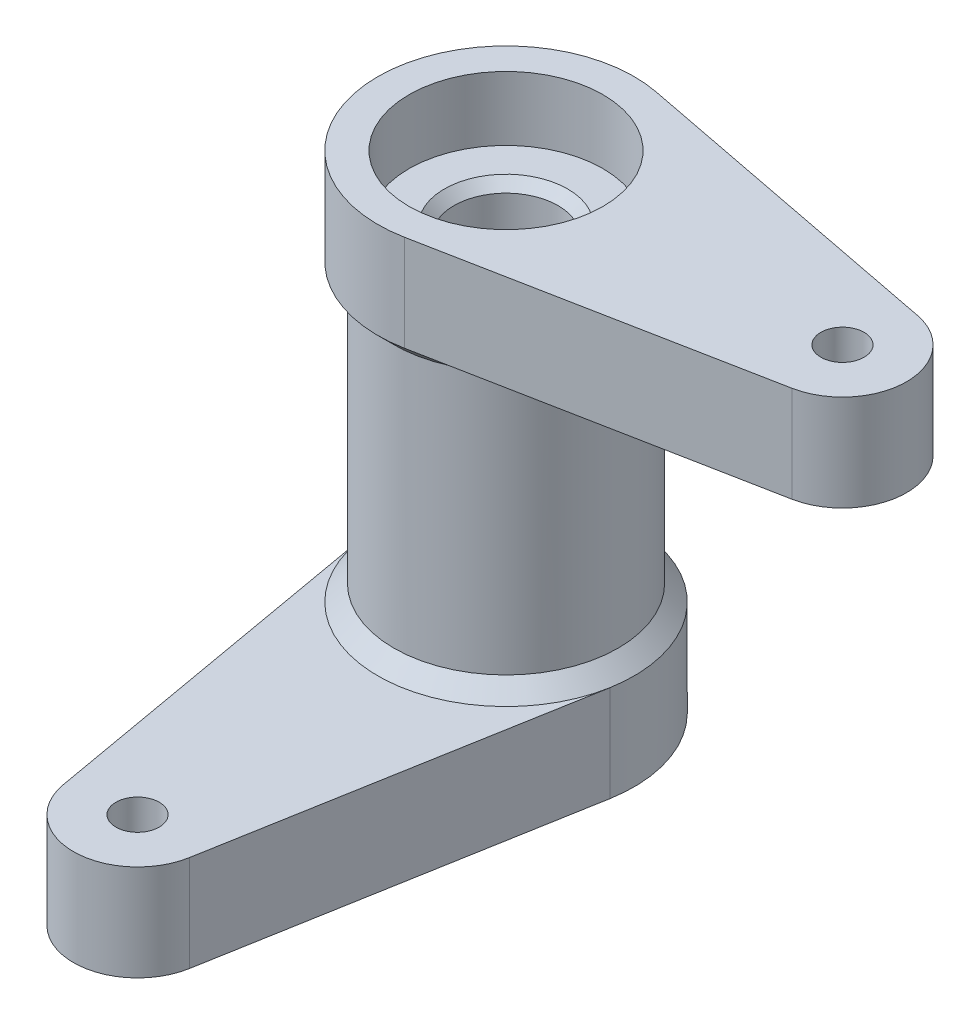
ISO-10303-21;
HEADER;
FILE_DESCRIPTION(('STEP AP214'),'2;1');
FILE_NAME('part.step','',(''),(''),'','','');
FILE_SCHEMA(('AUTOMOTIVE_DESIGN { 1 0 10303 214 1 1 1 1 }'));
ENDSEC;
DATA;
#1=APPLICATION_CONTEXT('core data for automotive mechanical design processes');
#2=APPLICATION_PROTOCOL_DEFINITION('international standard','automotive_design',2000,#1);
#3=PRODUCT_CONTEXT('',#1,'mechanical');
#4=PRODUCT('Part','Part','',(#3));
#5=PRODUCT_RELATED_PRODUCT_CATEGORY('part','',(#4));
#6=PRODUCT_DEFINITION_FORMATION('','',#4);
#7=PRODUCT_DEFINITION_CONTEXT('part definition',#1,'design');
#8=PRODUCT_DEFINITION('design','',#6,#7);
#9=PRODUCT_DEFINITION_SHAPE('','',#8);
#10=(LENGTH_UNIT() NAMED_UNIT(*) SI_UNIT(.MILLI.,.METRE.));
#11=(NAMED_UNIT(*) PLANE_ANGLE_UNIT() SI_UNIT($,.RADIAN.));
#12=(NAMED_UNIT(*) SI_UNIT($,.STERADIAN.) SOLID_ANGLE_UNIT());
#13=UNCERTAINTY_MEASURE_WITH_UNIT(LENGTH_MEASURE(1.E-05),#10,'distance_accuracy_value','');
#14=(GEOMETRIC_REPRESENTATION_CONTEXT(3) GLOBAL_UNCERTAINTY_ASSIGNED_CONTEXT((#13)) GLOBAL_UNIT_ASSIGNED_CONTEXT((#10,
#11,#12)) REPRESENTATION_CONTEXT('',''));
#15=CARTESIAN_POINT('',(0.,0.,0.));
#16=DIRECTION('',(0.,0.,1.));
#17=DIRECTION('',(1.,0.,0.));
#18=AXIS2_PLACEMENT_3D('',#15,#16,#17);
#19=CARTESIAN_POINT('',(21.,24.4,0.));
#20=DIRECTION('',(0.,1.,0.));
#21=DIRECTION('',(0.,0.,1.));
#22=AXIS2_PLACEMENT_3D('',#19,#20,#21);
#23=CYLINDRICAL_SURFACE('',#22,1.35);
#24=CARTESIAN_POINT('',(21.,30.4,0.));
#25=DIRECTION('',(0.,1.,0.));
#26=DIRECTION('',(0.,0.,1.));
#27=AXIS2_PLACEMENT_3D('',#24,#25,#26);
#28=CIRCLE('',#27,1.35);
#29=CARTESIAN_POINT('',(21.,30.4,1.35000000000008));
#30=VERTEX_POINT('',#29);
#31=EDGE_CURVE('E216',#30,#30,#28,.T.);
#32=ORIENTED_EDGE('',*,*,#31,.T.);
#33=EDGE_LOOP('',(#32));
#34=FACE_BOUND('',#33,.T.);
#35=CARTESIAN_POINT('',(21.,27.4,0.));
#36=DIRECTION('',(0.,-1.,0.));
#37=DIRECTION('',(0.,0.,-1.));
#38=AXIS2_PLACEMENT_3D('',#35,#36,#37);
#39=CIRCLE('',#38,1.35);
#40=CARTESIAN_POINT('',(21.,27.4,-1.34999999999993));
#41=VERTEX_POINT('',#40);
#42=EDGE_CURVE('E43',#41,#41,#39,.F.);
#43=ORIENTED_EDGE('',*,*,#42,.F.);
#44=EDGE_LOOP('',(#43));
#45=FACE_BOUND('',#44,.T.);
#46=ADVANCED_FACE('F39',(#34,#45),#23,.F.);
#47=CARTESIAN_POINT('',(0.,0.,0.));
#48=DIRECTION('',(0.,-1.,0.));
#49=DIRECTION('',(0.,0.,-1.));
#50=AXIS2_PLACEMENT_3D('',#47,#48,#49);
#51=CYLINDRICAL_SURFACE('',#50,8.00000000000001);
#52=DIRECTION('',(0.,1.,0.));
#53=VECTOR('',#52,1.);
#54=CARTESIAN_POINT('',(1.5238095238095,24.4,7.85353452498604));
#55=LINE('',#54,#53);
#56=CARTESIAN_POINT('',(1.5238095238095,24.4,7.85353452498603));
#57=VERTEX_POINT('',#56);
#58=CARTESIAN_POINT('',(1.5238095238095,30.4,7.85353452498604));
#59=VERTEX_POINT('',#58);
#60=EDGE_CURVE('E247',#57,#59,#55,.T.);
#61=ORIENTED_EDGE('',*,*,#60,.T.);
#62=CARTESIAN_POINT('',(0.,30.4,0.));
#63=DIRECTION('',(0.,-1.,0.));
#64=DIRECTION('',(0.,0.,-1.));
#65=AXIS2_PLACEMENT_3D('',#62,#63,#64);
#66=CIRCLE('',#65,8.00000000000001);
#67=CARTESIAN_POINT('',(1.52380952380956,30.4,-7.85353452498602));
#68=VERTEX_POINT('',#67);
#69=EDGE_CURVE('E322',#59,#68,#66,.T.);
#70=ORIENTED_EDGE('',*,*,#69,.T.);
#71=DIRECTION('',(0.,1.,0.));
#72=VECTOR('',#71,1.);
#73=CARTESIAN_POINT('',(1.52380952380956,24.4,-7.85353452498602));
#74=LINE('',#73,#72);
#75=CARTESIAN_POINT('',(1.52380952380956,24.4,-7.85353452498602));
#76=VERTEX_POINT('',#75);
#77=EDGE_CURVE('E251',#76,#68,#74,.T.);
#78=ORIENTED_EDGE('',*,*,#77,.F.);
#79=CARTESIAN_POINT('',(0.,24.4,0.));
#80=DIRECTION('',(0.,-1.,0.));
#81=DIRECTION('',(0.,0.,-1.));
#82=AXIS2_PLACEMENT_3D('',#79,#80,#81);
#83=CIRCLE('',#82,8.);
#84=EDGE_CURVE('E317',#57,#76,#83,.T.);
#85=ORIENTED_EDGE('',*,*,#84,.F.);
#86=EDGE_LOOP('',(#61,#70,#78,#85));
#87=FACE_BOUND('',#86,.T.);
#88=ADVANCED_FACE('F363',(#87),#51,.T.);
#89=CARTESIAN_POINT('',(-7.99999999999998,0.,0.));
#90=DIRECTION('',(0.,1.,0.));
#91=DIRECTION('',(0.,0.,1.));
#92=AXIS2_PLACEMENT_3D('',#89,#90,#91);
#93=PLANE('',#92);
#94=CARTESIAN_POINT('',(0.,0.,0.));
#95=DIRECTION('',(0.,-1.,0.));
#96=DIRECTION('',(0.,0.,-1.));
#97=AXIS2_PLACEMENT_3D('',#94,#95,#96);
#98=CIRCLE('',#97,6.04999999999997);
#99=CARTESIAN_POINT('',(0.,0.,-6.04999999999997));
#100=VERTEX_POINT('',#99);
#101=EDGE_CURVE('E11',#100,#100,#98,.T.);
#102=ORIENTED_EDGE('',*,*,#101,.F.);
#103=EDGE_LOOP('',(#102));
#104=FACE_BOUND('',#103,.T.);
#105=CARTESIAN_POINT('',(0.,0.,0.));
#106=DIRECTION('',(0.,-1.,0.));
#107=DIRECTION('',(0.,0.,-1.));
#108=AXIS2_PLACEMENT_3D('',#105,#106,#107);
#109=CIRCLE('',#108,7.99999999999998);
#110=CARTESIAN_POINT('',(-7.87808810636948,0.,1.39130434782608));
#111=VERTEX_POINT('',#110);
#112=CARTESIAN_POINT('',(7.87808810636946,0.,1.39130434782608));
#113=VERTEX_POINT('',#112);
#114=EDGE_CURVE('E300',#111,#113,#109,.T.);
#115=ORIENTED_EDGE('',*,*,#114,.T.);
#116=DIRECTION('',(0.173913043478261,0.,-0.984761013296185));
#117=VECTOR('',#116,1.);
#118=CARTESIAN_POINT('',(3.93904405318474,0.,23.695652173913));
#119=LINE('',#118,#117);
#120=CARTESIAN_POINT('',(3.93904405318474,0.,23.695652173913));
#121=VERTEX_POINT('',#120);
#122=EDGE_CURVE('E280',#121,#113,#119,.T.);
#123=ORIENTED_EDGE('',*,*,#122,.F.);
#124=CARTESIAN_POINT('',(0.,0.,23.));
#125=DIRECTION('',(0.,1.,0.));
#126=DIRECTION('',(0.,0.,-1.));
#127=AXIS2_PLACEMENT_3D('',#124,#125,#126);
#128=CIRCLE('',#127,4.);
#129=CARTESIAN_POINT('',(-3.93904405318474,0.,23.695652173913));
#130=VERTEX_POINT('',#129);
#131=EDGE_CURVE('E260',#130,#121,#128,.T.);
#132=ORIENTED_EDGE('',*,*,#131,.F.);
#133=DIRECTION('',(0.173913043478261,0.,0.984761013296185));
#134=VECTOR('',#133,1.);
#135=CARTESIAN_POINT('',(-7.87808810636948,0.,1.39130434782609));
#136=LINE('',#135,#134);
#137=EDGE_CURVE('E269',#111,#130,#136,.T.);
#138=ORIENTED_EDGE('',*,*,#137,.F.);
#139=EDGE_LOOP('',(#115,#123,#132,#138));
#140=FACE_BOUND('',#139,.T.);
#141=CARTESIAN_POINT('',(0.,0.,23.));
#142=DIRECTION('',(0.,1.,0.));
#143=DIRECTION('',(0.,0.,1.));
#144=AXIS2_PLACEMENT_3D('',#141,#142,#143);
#145=CIRCLE('',#144,1.35);
#146=CARTESIAN_POINT('',(0.,0.,21.65));
#147=VERTEX_POINT('',#146);
#148=EDGE_CURVE('E246',#147,#147,#145,.T.);
#149=ORIENTED_EDGE('',*,*,#148,.T.);
#150=EDGE_LOOP('',(#149));
#151=FACE_BOUND('',#150,.T.);
#152=ADVANCED_FACE('F41',(#104,#140,#151),#93,.F.);
#153=CARTESIAN_POINT('',(0.,0.,0.));
#154=DIRECTION('',(0.,-1.,0.));
#155=DIRECTION('',(0.,0.,-1.));
#156=AXIS2_PLACEMENT_3D('',#153,#154,#155);
#157=CYLINDRICAL_SURFACE('',#156,6.04999999999997);
#158=CARTESIAN_POINT('',(0.,4.,0.));
#159=DIRECTION('',(0.,-1.,0.));
#160=DIRECTION('',(0.,0.,-1.));
#161=AXIS2_PLACEMENT_3D('',#158,#159,#160);
#162=CIRCLE('',#161,6.04999999999997);
#163=CARTESIAN_POINT('',(0.,4.,-6.04999999999997));
#164=VERTEX_POINT('',#163);
#165=EDGE_CURVE('E49',#164,#164,#162,.T.);
#166=ORIENTED_EDGE('',*,*,#165,.F.);
#167=EDGE_LOOP('',(#166));
#168=FACE_BOUND('',#167,.T.);
#169=ORIENTED_EDGE('',*,*,#101,.T.);
#170=EDGE_LOOP('',(#169));
#171=FACE_BOUND('',#170,.T.);
#172=ADVANCED_FACE('F356',(#168,#171),#157,.F.);
#173=CARTESIAN_POINT('',(-6.04999999999997,4.,0.));
#174=DIRECTION('',(0.,1.,0.));
#175=DIRECTION('',(0.,0.,1.));
#176=AXIS2_PLACEMENT_3D('',#173,#174,#175);
#177=PLANE('',#176);
#178=CARTESIAN_POINT('',(0.,4.,0.));
#179=DIRECTION('',(0.,-1.,0.));
#180=DIRECTION('',(0.,0.,-1.));
#181=AXIS2_PLACEMENT_3D('',#178,#179,#180);
#182=CIRCLE('',#181,3.85);
#183=CARTESIAN_POINT('',(0.,4.,-3.85));
#184=VERTEX_POINT('',#183);
#185=EDGE_CURVE('E346',#184,#184,#182,.T.);
#186=ORIENTED_EDGE('',*,*,#185,.F.);
#187=EDGE_LOOP('',(#186));
#188=FACE_BOUND('',#187,.T.);
#189=ORIENTED_EDGE('',*,*,#165,.T.);
#190=EDGE_LOOP('',(#189));
#191=FACE_BOUND('',#190,.T.);
#192=ADVANCED_FACE('F354',(#188,#191),#177,.F.);
#193=CARTESIAN_POINT('',(0.,4.,0.));
#194=DIRECTION('',(0.,-1.,0.));
#195=DIRECTION('',(0.,0.,-1.));
#196=AXIS2_PLACEMENT_3D('',#193,#194,#195);
#197=CONICAL_SURFACE('',#196,3.85,0.785398163397448);
#198=CARTESIAN_POINT('',(0.,4.6,0.));
#199=DIRECTION('',(0.,-1.,0.));
#200=DIRECTION('',(0.,0.,-1.));
#201=AXIS2_PLACEMENT_3D('',#198,#199,#200);
#202=CIRCLE('',#201,3.25);
#203=CARTESIAN_POINT('',(0.,4.6,-3.25));
#204=VERTEX_POINT('',#203);
#205=EDGE_CURVE('E342',#204,#204,#202,.T.);
#206=ORIENTED_EDGE('',*,*,#205,.F.);
#207=EDGE_LOOP('',(#206));
#208=FACE_BOUND('',#207,.T.);
#209=ORIENTED_EDGE('',*,*,#185,.T.);
#210=EDGE_LOOP('',(#209));
#211=FACE_BOUND('',#210,.T.);
#212=ADVANCED_FACE('F452',(#208,#211),#197,.F.);
#213=CARTESIAN_POINT('',(0.,0.,0.));
#214=DIRECTION('',(0.,-1.,0.));
#215=DIRECTION('',(0.,0.,-1.));
#216=AXIS2_PLACEMENT_3D('',#213,#214,#215);
#217=CYLINDRICAL_SURFACE('',#216,3.25);
#218=CARTESIAN_POINT('',(0.,25.8,0.));
#219=DIRECTION('',(0.,-1.,0.));
#220=DIRECTION('',(0.,0.,-1.));
#221=AXIS2_PLACEMENT_3D('',#218,#219,#220);
#222=CIRCLE('',#221,3.25);
#223=CARTESIAN_POINT('',(0.,25.8,-3.25));
#224=VERTEX_POINT('',#223);
#225=EDGE_CURVE('E338',#224,#224,#222,.T.);
#226=ORIENTED_EDGE('',*,*,#225,.F.);
#227=EDGE_LOOP('',(#226));
#228=FACE_BOUND('',#227,.T.);
#229=ORIENTED_EDGE('',*,*,#205,.T.);
#230=EDGE_LOOP('',(#229));
#231=FACE_BOUND('',#230,.T.);
#232=ADVANCED_FACE('F448',(#228,#231),#217,.F.);
#233=CARTESIAN_POINT('',(0.,25.8,0.));
#234=DIRECTION('',(0.,1.,0.));
#235=DIRECTION('',(0.,0.,1.));
#236=AXIS2_PLACEMENT_3D('',#233,#234,#235);
#237=CONICAL_SURFACE('',#236,3.25,0.785398163397448);
#238=CARTESIAN_POINT('',(0.,26.4,0.));
#239=DIRECTION('',(0.,-1.,0.));
#240=DIRECTION('',(0.,0.,-1.));
#241=AXIS2_PLACEMENT_3D('',#238,#239,#240);
#242=CIRCLE('',#241,3.85);
#243=CARTESIAN_POINT('',(0.,26.4,-3.85));
#244=VERTEX_POINT('',#243);
#245=EDGE_CURVE('E334',#244,#244,#242,.T.);
#246=ORIENTED_EDGE('',*,*,#245,.F.);
#247=EDGE_LOOP('',(#246));
#248=FACE_BOUND('',#247,.T.);
#249=ORIENTED_EDGE('',*,*,#225,.T.);
#250=EDGE_LOOP('',(#249));
#251=FACE_BOUND('',#250,.T.);
#252=ADVANCED_FACE('F444',(#248,#251),#237,.F.);
#253=CARTESIAN_POINT('',(-3.85,26.4,0.));
#254=DIRECTION('',(0.,-1.,0.));
#255=DIRECTION('',(0.,0.,-1.));
#256=AXIS2_PLACEMENT_3D('',#253,#254,#255);
#257=PLANE('',#256);
#258=CARTESIAN_POINT('',(0.,26.4,0.));
#259=DIRECTION('',(0.,-1.,0.));
#260=DIRECTION('',(0.,0.,-1.));
#261=AXIS2_PLACEMENT_3D('',#258,#259,#260);
#262=CIRCLE('',#261,6.05000000000001);
#263=CARTESIAN_POINT('',(0.,26.4,-6.05000000000001));
#264=VERTEX_POINT('',#263);
#265=EDGE_CURVE('E330',#264,#264,#262,.T.);
#266=ORIENTED_EDGE('',*,*,#265,.F.);
#267=EDGE_LOOP('',(#266));
#268=FACE_BOUND('',#267,.T.);
#269=ORIENTED_EDGE('',*,*,#245,.T.);
#270=EDGE_LOOP('',(#269));
#271=FACE_BOUND('',#270,.T.);
#272=ADVANCED_FACE('F440',(#268,#271),#257,.F.);
#273=CARTESIAN_POINT('',(0.,0.,0.));
#274=DIRECTION('',(0.,-1.,0.));
#275=DIRECTION('',(0.,0.,-1.));
#276=AXIS2_PLACEMENT_3D('',#273,#274,#275);
#277=CYLINDRICAL_SURFACE('',#276,6.05000000000001);
#278=CARTESIAN_POINT('',(0.,30.4,0.));
#279=DIRECTION('',(0.,-1.,0.));
#280=DIRECTION('',(0.,0.,-1.));
#281=AXIS2_PLACEMENT_3D('',#278,#279,#280);
#282=CIRCLE('',#281,6.05000000000001);
#283=CARTESIAN_POINT('',(0.,30.4,-6.05000000000001));
#284=VERTEX_POINT('',#283);
#285=EDGE_CURVE('E326',#284,#284,#282,.T.);
#286=ORIENTED_EDGE('',*,*,#285,.F.);
#287=EDGE_LOOP('',(#286));
#288=FACE_BOUND('',#287,.T.);
#289=ORIENTED_EDGE('',*,*,#265,.T.);
#290=EDGE_LOOP('',(#289));
#291=FACE_BOUND('',#290,.T.);
#292=ADVANCED_FACE('F433',(#288,#291),#277,.F.);
#293=CARTESIAN_POINT('',(-6.05000000000001,30.4,0.));
#294=DIRECTION('',(0.,-1.,0.));
#295=DIRECTION('',(0.,0.,-1.));
#296=AXIS2_PLACEMENT_3D('',#293,#294,#295);
#297=PLANE('',#296);
#298=ORIENTED_EDGE('',*,*,#69,.F.);
#299=DIRECTION('',(0.981691815623253,0.,-0.190476190476188));
#300=VECTOR('',#299,1.);
#301=CARTESIAN_POINT('',(21.7619047619048,30.4,3.92676726249309));
#302=LINE('',#301,#300);
#303=CARTESIAN_POINT('',(21.7619047619048,30.4,3.92676726249309));
#304=VERTEX_POINT('',#303);
#305=EDGE_CURVE('E226',#59,#304,#302,.T.);
#306=ORIENTED_EDGE('',*,*,#305,.T.);
#307=CARTESIAN_POINT('',(21.,30.4,0.));
#308=DIRECTION('',(0.,1.,0.));
#309=DIRECTION('',(0.,0.,1.));
#310=AXIS2_PLACEMENT_3D('',#307,#308,#309);
#311=CIRCLE('',#310,4.);
#312=CARTESIAN_POINT('',(21.7619047619048,30.4,-3.92676726249293));
#313=VERTEX_POINT('',#312);
#314=EDGE_CURVE('E220',#304,#313,#311,.T.);
#315=ORIENTED_EDGE('',*,*,#314,.T.);
#316=DIRECTION('',(-0.981691815623252,0.,-0.190476190476195));
#317=VECTOR('',#316,1.);
#318=CARTESIAN_POINT('',(21.7619047619048,30.4,-3.92676726249293));
#319=LINE('',#318,#317);
#320=EDGE_CURVE('E236',#313,#68,#319,.T.);
#321=ORIENTED_EDGE('',*,*,#320,.T.);
#322=EDGE_LOOP('',(#298,#306,#315,#321));
#323=FACE_BOUND('',#322,.T.);
#324=ORIENTED_EDGE('',*,*,#285,.T.);
#325=EDGE_LOOP('',(#324));
#326=FACE_BOUND('',#325,.T.);
#327=ORIENTED_EDGE('',*,*,#31,.F.);
#328=EDGE_LOOP('',(#327));
#329=FACE_BOUND('',#328,.T.);
#330=ADVANCED_FACE('F415',(#323,#326,#329),#297,.F.);
#331=CARTESIAN_POINT('',(0.,24.4,0.));
#332=DIRECTION('',(0.,1.,0.));
#333=DIRECTION('',(0.,0.,1.));
#334=AXIS2_PLACEMENT_3D('',#331,#332,#333);
#335=CONICAL_SURFACE('',#334,8.,0.785398163397414);
#336=CARTESIAN_POINT('',(0.,23.3999999999999,0.));
#337=DIRECTION('',(0.,-1.,0.));
#338=DIRECTION('',(0.,0.,-1.));
#339=AXIS2_PLACEMENT_3D('',#336,#337,#338);
#340=CIRCLE('',#339,6.99999999999997);
#341=CARTESIAN_POINT('',(0.,23.3999999999999,-6.99999999999997));
#342=VERTEX_POINT('',#341);
#343=EDGE_CURVE('E313',#342,#342,#340,.T.);
#344=ORIENTED_EDGE('',*,*,#343,.F.);
#345=EDGE_LOOP('',(#344));
#346=FACE_BOUND('',#345,.T.);
#347=EDGE_CURVE('E318',#76,#57,#83,.T.);
#348=ORIENTED_EDGE('',*,*,#347,.T.);
#349=ORIENTED_EDGE('',*,*,#84,.T.);
#350=EDGE_LOOP('',(#348,#349));
#351=FACE_BOUND('',#350,.T.);
#352=ADVANCED_FACE('F421',(#346,#351),#335,.T.);
#353=CARTESIAN_POINT('',(0.,0.,0.));
#354=DIRECTION('',(0.,-1.,0.));
#355=DIRECTION('',(0.,0.,-1.));
#356=AXIS2_PLACEMENT_3D('',#353,#354,#355);
#357=CYLINDRICAL_SURFACE('',#356,6.99999999999997);
#358=CARTESIAN_POINT('',(0.,6.99999999999999,0.));
#359=DIRECTION('',(0.,-1.,0.));
#360=DIRECTION('',(0.,0.,-1.));
#361=AXIS2_PLACEMENT_3D('',#358,#359,#360);
#362=CIRCLE('',#361,6.99999999999997);
#363=CARTESIAN_POINT('',(0.,6.99999999999999,-6.99999999999997));
#364=VERTEX_POINT('',#363);
#365=EDGE_CURVE('E309',#364,#364,#362,.T.);
#366=ORIENTED_EDGE('',*,*,#365,.F.);
#367=EDGE_LOOP('',(#366));
#368=FACE_BOUND('',#367,.T.);
#369=ORIENTED_EDGE('',*,*,#343,.T.);
#370=EDGE_LOOP('',(#369));
#371=FACE_BOUND('',#370,.T.);
#372=ADVANCED_FACE('F423',(#368,#371),#357,.T.);
#373=CARTESIAN_POINT('',(0.,6.99999999999999,0.));
#374=DIRECTION('',(0.,-1.,0.));
#375=DIRECTION('',(0.,0.,-1.));
#376=AXIS2_PLACEMENT_3D('',#373,#374,#375);
#377=CONICAL_SURFACE('',#376,6.99999999999997,0.785398163397489);
#378=CARTESIAN_POINT('',(0.,6.00000000000005,0.));
#379=DIRECTION('',(0.,-1.,0.));
#380=DIRECTION('',(0.,0.,-1.));
#381=AXIS2_PLACEMENT_3D('',#378,#379,#380);
#382=CIRCLE('',#381,7.99999999999999);
#383=CARTESIAN_POINT('',(7.87808810636947,6.00000000000005,1.39130434782609));
#384=VERTEX_POINT('',#383);
#385=CARTESIAN_POINT('',(-7.87808810636947,6.00000000000005,1.39130434782609));
#386=VERTEX_POINT('',#385);
#387=EDGE_CURVE('E305',#384,#386,#382,.T.);
#388=ORIENTED_EDGE('',*,*,#387,.F.);
#389=EDGE_CURVE('E304',#386,#384,#382,.T.);
#390=ORIENTED_EDGE('',*,*,#389,.F.);
#391=EDGE_LOOP('',(#388,#390));
#392=FACE_BOUND('',#391,.T.);
#393=ORIENTED_EDGE('',*,*,#365,.T.);
#394=EDGE_LOOP('',(#393));
#395=FACE_BOUND('',#394,.T.);
#396=ADVANCED_FACE('F430',(#392,#395),#377,.T.);
#397=CARTESIAN_POINT('',(0.,0.,0.));
#398=DIRECTION('',(0.,-1.,0.));
#399=DIRECTION('',(0.,0.,-1.));
#400=AXIS2_PLACEMENT_3D('',#397,#398,#399);
#401=CYLINDRICAL_SURFACE('',#400,7.99999999999999);
#402=ORIENTED_EDGE('',*,*,#389,.T.);
#403=DIRECTION('',(0.,-1.,0.));
#404=VECTOR('',#403,1.);
#405=CARTESIAN_POINT('',(7.87808810636948,6.00000000000005,1.39130434782609));
#406=LINE('',#405,#404);
#407=EDGE_CURVE('E293',#384,#113,#406,.T.);
#408=ORIENTED_EDGE('',*,*,#407,.T.);
#409=ORIENTED_EDGE('',*,*,#114,.F.);
#410=DIRECTION('',(0.,-1.,0.));
#411=VECTOR('',#410,1.);
#412=CARTESIAN_POINT('',(-7.87808810636948,6.00000000000005,1.39130434782608));
#413=LINE('',#412,#411);
#414=EDGE_CURVE('E289',#386,#111,#413,.T.);
#415=ORIENTED_EDGE('',*,*,#414,.F.);
#416=EDGE_LOOP('',(#402,#408,#409,#415));
#417=FACE_BOUND('',#416,.T.);
#418=ADVANCED_FACE('F609',(#417),#401,.T.);
#419=CARTESIAN_POINT('',(0.,6.00000000000005,23.));
#420=DIRECTION('',(0.,-1.,0.));
#421=DIRECTION('',(0.,0.,-1.));
#422=AXIS2_PLACEMENT_3D('',#419,#420,#421);
#423=PLANE('',#422);
#424=CARTESIAN_POINT('',(0.,6.00000000000005,23.));
#425=DIRECTION('',(0.,1.,0.));
#426=DIRECTION('',(0.,0.,-1.));
#427=AXIS2_PLACEMENT_3D('',#424,#425,#426);
#428=CIRCLE('',#427,4.);
#429=CARTESIAN_POINT('',(-3.93904405318474,6.00000000000005,23.695652173913));
#430=VERTEX_POINT('',#429);
#431=CARTESIAN_POINT('',(3.93904405318474,6.00000000000005,23.695652173913));
#432=VERTEX_POINT('',#431);
#433=EDGE_CURVE('E264',#430,#432,#428,.T.);
#434=ORIENTED_EDGE('',*,*,#433,.T.);
#435=DIRECTION('',(0.173913043478261,0.,-0.984761013296185));
#436=VECTOR('',#435,1.);
#437=CARTESIAN_POINT('',(3.93904405318474,6.00000000000005,23.695652173913));
#438=LINE('',#437,#436);
#439=EDGE_CURVE('E268',#432,#384,#438,.T.);
#440=ORIENTED_EDGE('',*,*,#439,.T.);
#441=ORIENTED_EDGE('',*,*,#387,.T.);
#442=DIRECTION('',(0.173913043478261,0.,0.984761013296185));
#443=VECTOR('',#442,1.);
#444=CARTESIAN_POINT('',(-7.87808810636948,6.00000000000005,1.39130434782609));
#445=LINE('',#444,#443);
#446=EDGE_CURVE('E273',#386,#430,#445,.T.);
#447=ORIENTED_EDGE('',*,*,#446,.T.);
#448=EDGE_LOOP('',(#434,#440,#441,#447));
#449=FACE_BOUND('',#448,.T.);
#450=CARTESIAN_POINT('',(0.,6.00000000000005,23.));
#451=DIRECTION('',(0.,1.,0.));
#452=DIRECTION('',(0.,0.,1.));
#453=AXIS2_PLACEMENT_3D('',#450,#451,#452);
#454=CIRCLE('',#453,1.35);
#455=CARTESIAN_POINT('',(0.,6.00000000000005,21.65));
#456=VERTEX_POINT('',#455);
#457=EDGE_CURVE('E256',#456,#456,#454,.T.);
#458=ORIENTED_EDGE('',*,*,#457,.F.);
#459=EDGE_LOOP('',(#458));
#460=FACE_BOUND('',#459,.T.);
#461=ADVANCED_FACE('F617',(#449,#460),#423,.F.);
#462=CARTESIAN_POINT('',(0.,6.00000000000005,23.));
#463=DIRECTION('',(0.,-1.,0.));
#464=DIRECTION('',(0.,0.,-1.));
#465=AXIS2_PLACEMENT_3D('',#462,#463,#464);
#466=CYLINDRICAL_SURFACE('',#465,4.);
#467=ORIENTED_EDGE('',*,*,#131,.T.);
#468=DIRECTION('',(0.,-1.,0.));
#469=VECTOR('',#468,1.);
#470=CARTESIAN_POINT('',(3.93904405318474,6.00000000000005,23.695652173913));
#471=LINE('',#470,#469);
#472=EDGE_CURVE('E296',#432,#121,#471,.T.);
#473=ORIENTED_EDGE('',*,*,#472,.F.);
#474=ORIENTED_EDGE('',*,*,#433,.F.);
#475=DIRECTION('',(0.,-1.,0.));
#476=VECTOR('',#475,1.);
#477=CARTESIAN_POINT('',(-3.93904405318474,6.00000000000005,23.695652173913));
#478=LINE('',#477,#476);
#479=EDGE_CURVE('E276',#430,#130,#478,.T.);
#480=ORIENTED_EDGE('',*,*,#479,.T.);
#481=EDGE_LOOP('',(#467,#473,#474,#480));
#482=FACE_BOUND('',#481,.T.);
#483=ADVANCED_FACE('F634',(#482),#466,.T.);
#484=CARTESIAN_POINT('',(3.93904405318474,6.00000000000005,23.695652173913));
#485=DIRECTION('',(-0.984761013296185,0.,-0.173913043478261));
#486=DIRECTION('',(-0.173913043478261,0.,0.984761013296185));
#487=AXIS2_PLACEMENT_3D('',#484,#485,#486);
#488=PLANE('',#487);
#489=ORIENTED_EDGE('',*,*,#122,.T.);
#490=ORIENTED_EDGE('',*,*,#407,.F.);
#491=ORIENTED_EDGE('',*,*,#439,.F.);
#492=ORIENTED_EDGE('',*,*,#472,.T.);
#493=EDGE_LOOP('',(#489,#490,#491,#492));
#494=FACE_BOUND('',#493,.T.);
#495=ADVANCED_FACE('F381',(#494),#488,.F.);
#496=CARTESIAN_POINT('',(-7.87808810636948,6.00000000000005,1.39130434782609));
#497=DIRECTION('',(0.984761013296185,0.,-0.173913043478261));
#498=DIRECTION('',(-0.173913043478261,0.,-0.984761013296185));
#499=AXIS2_PLACEMENT_3D('',#496,#497,#498);
#500=PLANE('',#499);
#501=ORIENTED_EDGE('',*,*,#137,.T.);
#502=ORIENTED_EDGE('',*,*,#479,.F.);
#503=ORIENTED_EDGE('',*,*,#446,.F.);
#504=ORIENTED_EDGE('',*,*,#414,.T.);
#505=EDGE_LOOP('',(#501,#502,#503,#504));
#506=FACE_BOUND('',#505,.T.);
#507=ADVANCED_FACE('F371',(#506),#500,.F.);
#508=CARTESIAN_POINT('',(0.,6.00000000000005,23.));
#509=DIRECTION('',(0.,-1.,0.));
#510=DIRECTION('',(0.,0.,-1.));
#511=AXIS2_PLACEMENT_3D('',#508,#509,#510);
#512=CYLINDRICAL_SURFACE('',#511,1.35);
#513=CARTESIAN_POINT('',(0.,6.00000000000005,21.65));
#514=CARTESIAN_POINT('',(0.,5.93750000000005,21.65));
#515=CARTESIAN_POINT('',(0.,5.87500000000005,21.65));
#516=CARTESIAN_POINT('',(0.,5.75000000000004,21.65));
#517=CARTESIAN_POINT('',(0.,5.68750000000004,21.65));
#518=CARTESIAN_POINT('',(0.,5.56250000000004,21.65));
#519=CARTESIAN_POINT('',(0.,5.50000000000004,21.65));
#520=CARTESIAN_POINT('',(0.,5.37500000000004,21.65));
#521=CARTESIAN_POINT('',(0.,5.31250000000004,21.65));
#522=CARTESIAN_POINT('',(0.,5.18750000000004,21.65));
#523=CARTESIAN_POINT('',(0.,5.12500000000004,21.65));
#524=CARTESIAN_POINT('',(0.,5.00000000000004,21.65));
#525=CARTESIAN_POINT('',(0.,4.93750000000004,21.65));
#526=CARTESIAN_POINT('',(0.,4.81250000000004,21.65));
#527=CARTESIAN_POINT('',(0.,4.75000000000004,21.65));
#528=CARTESIAN_POINT('',(0.,4.62500000000004,21.65));
#529=CARTESIAN_POINT('',(0.,4.56250000000004,21.65));
#530=CARTESIAN_POINT('',(0.,4.43750000000003,21.65));
#531=CARTESIAN_POINT('',(0.,4.37500000000003,21.65));
#532=CARTESIAN_POINT('',(0.,4.25000000000003,21.65));
#533=CARTESIAN_POINT('',(0.,4.18750000000003,21.65));
#534=CARTESIAN_POINT('',(0.,4.06250000000003,21.65));
#535=CARTESIAN_POINT('',(0.,4.00000000000003,21.65));
#536=CARTESIAN_POINT('',(0.,3.87500000000003,21.65));
#537=CARTESIAN_POINT('',(0.,3.81250000000003,21.65));
#538=CARTESIAN_POINT('',(0.,3.68750000000003,21.65));
#539=CARTESIAN_POINT('',(0.,3.62500000000003,21.65));
#540=CARTESIAN_POINT('',(0.,3.50000000000003,21.65));
#541=CARTESIAN_POINT('',(0.,3.43750000000003,21.65));
#542=CARTESIAN_POINT('',(0.,3.31250000000003,21.65));
#543=CARTESIAN_POINT('',(0.,3.25000000000002,21.65));
#544=CARTESIAN_POINT('',(0.,3.12500000000002,21.65));
#545=CARTESIAN_POINT('',(0.,3.06250000000002,21.65));
#546=CARTESIAN_POINT('',(0.,2.93750000000002,21.65));
#547=CARTESIAN_POINT('',(0.,2.87500000000002,21.65));
#548=CARTESIAN_POINT('',(0.,2.75000000000002,21.65));
#549=CARTESIAN_POINT('',(0.,2.68750000000002,21.65));
#550=CARTESIAN_POINT('',(0.,2.56250000000002,21.65));
#551=CARTESIAN_POINT('',(0.,2.50000000000002,21.65));
#552=CARTESIAN_POINT('',(0.,2.37500000000002,21.65));
#553=CARTESIAN_POINT('',(0.,2.31250000000002,21.65));
#554=CARTESIAN_POINT('',(0.,2.18750000000002,21.65));
#555=CARTESIAN_POINT('',(0.,2.12500000000002,21.65));
#556=CARTESIAN_POINT('',(0.,2.00000000000002,21.65));
#557=CARTESIAN_POINT('',(0.,1.93750000000001,21.65));
#558=CARTESIAN_POINT('',(0.,1.81250000000001,21.65));
#559=CARTESIAN_POINT('',(0.,1.75000000000001,21.65));
#560=CARTESIAN_POINT('',(0.,1.62500000000001,21.65));
#561=CARTESIAN_POINT('',(0.,1.56250000000001,21.65));
#562=CARTESIAN_POINT('',(0.,1.43750000000001,21.65));
#563=CARTESIAN_POINT('',(0.,1.37500000000001,21.65));
#564=CARTESIAN_POINT('',(0.,1.25000000000001,21.65));
#565=CARTESIAN_POINT('',(0.,1.18750000000001,21.65));
#566=CARTESIAN_POINT('',(0.,1.06250000000001,21.65));
#567=CARTESIAN_POINT('',(0.,1.00000000000001,21.65));
#568=CARTESIAN_POINT('',(0.,0.875000000000006,21.65));
#569=CARTESIAN_POINT('',(0.,0.812500000000006,21.65));
#570=CARTESIAN_POINT('',(0.,0.687500000000005,21.65));
#571=CARTESIAN_POINT('',(0.,0.625000000000004,21.65));
#572=CARTESIAN_POINT('',(0.,0.500000000000003,21.65));
#573=CARTESIAN_POINT('',(0.,0.437500000000003,21.65));
#574=CARTESIAN_POINT('',(0.,0.312500000000002,21.65));
#575=CARTESIAN_POINT('',(0.,0.250000000000001,21.65));
#576=CARTESIAN_POINT('',(0.,0.125,21.65));
#577=CARTESIAN_POINT('',(0.,0.0624999999999998,21.65));
#578=CARTESIAN_POINT('',(0.,0.,21.65));
#579=B_SPLINE_CURVE_WITH_KNOTS('',3,(#513,#514,#515,#516,#517,#518,#519,#520,#521,#522,#523,
#524,#525,#526,#527,#528,#529,#530,#531,#532,#533,#534,#535,#536,#537,#538,#539,#540,#541,#542,
#543,#544,#545,#546,#547,#548,#549,#550,#551,#552,#553,#554,#555,#556,#557,#558,#559,#560,#561,
#562,#563,#564,#565,#566,#567,#568,#569,#570,#571,#572,#573,#574,#575,#576,#577,#578),
.UNSPECIFIED.,.F.,.F.,(4,2,2,2,2,2,2,2,2,2,2,2,2,2,2,2,2,2,2,2,2,2,2,2,2,2,2,2,2,2,2,2,4),(0.,
0.187500000000001,0.375000000000003,0.562500000000004,0.750000000000005,0.937500000000007,
1.12500000000001,1.31250000000001,1.50000000000001,1.68750000000001,1.87500000000001,
2.06250000000002,2.25000000000002,2.43750000000002,2.62500000000002,2.81250000000002,
3.00000000000002,3.18750000000002,3.37500000000003,3.56250000000003,3.75000000000003,
3.93750000000003,4.12500000000003,4.31250000000003,4.50000000000004,4.68750000000004,
4.87500000000004,5.06250000000004,5.25000000000004,5.43750000000004,5.62500000000004,
5.81250000000005,6.00000000000005),.UNSPECIFIED.);
#580=EDGE_CURVE('BSEAM368',#456,#147,#579,.T.);
#581=ORIENTED_EDGE('',*,*,#457,.T.);
#582=ORIENTED_EDGE('',*,*,#148,.F.);
#583=ORIENTED_EDGE('',*,*,#580,.T.);
#584=ORIENTED_EDGE('',*,*,#580,.F.);
#585=EDGE_LOOP('',(#581,#583,#582,#584));
#586=FACE_BOUND('',#585,.T.);
#587=ADVANCED_FACE('F368',(#586),#512,.F.);
#588=CARTESIAN_POINT('',(21.,24.4,0.));
#589=DIRECTION('',(0.,1.,0.));
#590=DIRECTION('',(0.,0.,1.));
#591=AXIS2_PLACEMENT_3D('',#588,#589,#590);
#592=CYLINDRICAL_SURFACE('',#591,4.);
#593=ORIENTED_EDGE('',*,*,#314,.F.);
#594=DIRECTION('',(0.,1.,0.));
#595=VECTOR('',#594,1.);
#596=CARTESIAN_POINT('',(21.7619047619048,24.4,3.92676726249309));
#597=LINE('',#596,#595);
#598=CARTESIAN_POINT('',(21.7619047619048,24.4,3.92676726249309));
#599=VERTEX_POINT('',#598);
#600=EDGE_CURVE('E243',#599,#304,#597,.T.);
#601=ORIENTED_EDGE('',*,*,#600,.F.);
#602=CARTESIAN_POINT('',(21.,24.4,0.));
#603=DIRECTION('',(0.,1.,0.));
#604=DIRECTION('',(0.,0.,1.));
#605=AXIS2_PLACEMENT_3D('',#602,#603,#604);
#606=CIRCLE('',#605,4.);
#607=CARTESIAN_POINT('',(21.7619047619048,24.4,-3.92676726249293));
#608=VERTEX_POINT('',#607);
#609=EDGE_CURVE('E221',#599,#608,#606,.T.);
#610=ORIENTED_EDGE('',*,*,#609,.T.);
#611=DIRECTION('',(0.,1.,0.));
#612=VECTOR('',#611,1.);
#613=CARTESIAN_POINT('',(21.7619047619048,24.4,-3.92676726249293));
#614=LINE('',#613,#612);
#615=EDGE_CURVE('E232',#608,#313,#614,.T.);
#616=ORIENTED_EDGE('',*,*,#615,.T.);
#617=EDGE_LOOP('',(#593,#601,#610,#616));
#618=FACE_BOUND('',#617,.T.);
#619=ADVANCED_FACE('F370',(#618),#592,.T.);
#620=CARTESIAN_POINT('',(21.7619047619048,24.4,3.92676726249309));
#621=DIRECTION('',(0.190476190476188,0.,0.981691815623253));
#622=DIRECTION('',(0.981691815623253,0.,-0.190476190476188));
#623=AXIS2_PLACEMENT_3D('',#620,#621,#622);
#624=PLANE('',#623);
#625=ORIENTED_EDGE('',*,*,#305,.F.);
#626=ORIENTED_EDGE('',*,*,#60,.F.);
#627=DIRECTION('',(0.981691815623253,0.,-0.190476190476188));
#628=VECTOR('',#627,1.);
#629=CARTESIAN_POINT('',(21.7619047619048,24.4,3.92676726249309));
#630=LINE('',#629,#628);
#631=EDGE_CURVE('E64',#57,#599,#630,.T.);
#632=ORIENTED_EDGE('',*,*,#631,.T.);
#633=ORIENTED_EDGE('',*,*,#600,.T.);
#634=EDGE_LOOP('',(#625,#626,#632,#633));
#635=FACE_BOUND('',#634,.T.);
#636=ADVANCED_FACE('F378',(#635),#624,.T.);
#637=CARTESIAN_POINT('',(21.7619047619048,24.4,-3.92676726249293));
#638=DIRECTION('',(0.190476190476195,0.,-0.981691815623252));
#639=DIRECTION('',(-0.981691815623252,0.,-0.190476190476195));
#640=AXIS2_PLACEMENT_3D('',#637,#638,#639);
#641=PLANE('',#640);
#642=ORIENTED_EDGE('',*,*,#320,.F.);
#643=ORIENTED_EDGE('',*,*,#615,.F.);
#644=DIRECTION('',(-0.981691815623252,0.,-0.190476190476195));
#645=VECTOR('',#644,1.);
#646=CARTESIAN_POINT('',(21.7619047619048,24.4,-3.92676726249293));
#647=LINE('',#646,#645);
#648=EDGE_CURVE('E225',#608,#76,#647,.T.);
#649=ORIENTED_EDGE('',*,*,#648,.T.);
#650=ORIENTED_EDGE('',*,*,#77,.T.);
#651=EDGE_LOOP('',(#642,#643,#649,#650));
#652=FACE_BOUND('',#651,.T.);
#653=ADVANCED_FACE('F400',(#652),#641,.T.);
#654=CARTESIAN_POINT('',(21.,24.4,0.));
#655=DIRECTION('',(0.,1.,0.));
#656=DIRECTION('',(0.,0.,1.));
#657=AXIS2_PLACEMENT_3D('',#654,#655,#656);
#658=PLANE('',#657);
#659=DIRECTION('',(0.866025403784438,0.,0.5));
#660=VECTOR('',#659,1.);
#661=CARTESIAN_POINT('',(21.,24.4,-3.17542648054287));
#662=LINE('',#661,#660);
#663=CARTESIAN_POINT('',(21.,24.4,-3.17542648054287));
#664=VERTEX_POINT('',#663);
#665=CARTESIAN_POINT('',(23.75,24.4,-1.5877132402714));
#666=VERTEX_POINT('',#665);
#667=EDGE_CURVE('E188',#664,#666,#662,.T.);
#668=ORIENTED_EDGE('',*,*,#667,.F.);
#669=DIRECTION('',(0.866025403784439,0.,-0.5));
#670=VECTOR('',#669,1.);
#671=CARTESIAN_POINT('',(18.25,24.4,-1.5877132402714));
#672=LINE('',#671,#670);
#673=CARTESIAN_POINT('',(18.25,24.4,-1.5877132402714));
#674=VERTEX_POINT('',#673);
#675=EDGE_CURVE('E56',#674,#664,#672,.T.);
#676=ORIENTED_EDGE('',*,*,#675,.F.);
#677=DIRECTION('',(0.,0.,-1.));
#678=VECTOR('',#677,1.);
#679=CARTESIAN_POINT('',(18.25,24.4,1.58771324027155));
#680=LINE('',#679,#678);
#681=CARTESIAN_POINT('',(18.25,24.4,1.58771324027155));
#682=VERTEX_POINT('',#681);
#683=EDGE_CURVE('E168',#682,#674,#680,.T.);
#684=ORIENTED_EDGE('',*,*,#683,.F.);
#685=DIRECTION('',(-0.866025403784439,0.,-0.5));
#686=VECTOR('',#685,1.);
#687=CARTESIAN_POINT('',(21.,24.4,3.17542648054302));
#688=LINE('',#687,#686);
#689=CARTESIAN_POINT('',(21.,24.4,3.17542648054302));
#690=VERTEX_POINT('',#689);
#691=EDGE_CURVE('E172',#690,#682,#688,.T.);
#692=ORIENTED_EDGE('',*,*,#691,.F.);
#693=DIRECTION('',(-0.866025403784439,0.,0.5));
#694=VECTOR('',#693,1.);
#695=CARTESIAN_POINT('',(23.75,24.4,1.58771324027155));
#696=LINE('',#695,#694);
#697=CARTESIAN_POINT('',(23.75,24.4,1.58771324027155));
#698=VERTEX_POINT('',#697);
#699=EDGE_CURVE('E195',#698,#690,#696,.T.);
#700=ORIENTED_EDGE('',*,*,#699,.F.);
#701=DIRECTION('',(0.,0.,1.));
#702=VECTOR('',#701,1.);
#703=CARTESIAN_POINT('',(23.75,24.4,-1.5877132402714));
#704=LINE('',#703,#702);
#705=EDGE_CURVE('E191',#666,#698,#704,.T.);
#706=ORIENTED_EDGE('',*,*,#705,.F.);
#707=EDGE_LOOP('',(#668,#676,#684,#692,#700,#706));
#708=FACE_BOUND('',#707,.T.);
#709=ORIENTED_EDGE('',*,*,#609,.F.);
#710=ORIENTED_EDGE('',*,*,#631,.F.);
#711=ORIENTED_EDGE('',*,*,#347,.F.);
#712=ORIENTED_EDGE('',*,*,#648,.F.);
#713=EDGE_LOOP('',(#709,#710,#711,#712));
#714=FACE_BOUND('',#713,.T.);
#715=ADVANCED_FACE('F397',(#708,#714),#658,.F.);
#716=CARTESIAN_POINT('',(0.,27.4,0.));
#717=DIRECTION('',(0.,-1.,0.));
#718=DIRECTION('',(0.,0.,-1.));
#719=AXIS2_PLACEMENT_3D('',#716,#717,#718);
#720=PLANE('',#719);
#721=DIRECTION('',(0.866025403784439,0.,-0.5));
#722=VECTOR('',#721,1.);
#723=CARTESIAN_POINT('',(18.25,27.4,-1.5877132402714));
#724=LINE('',#723,#722);
#725=CARTESIAN_POINT('',(18.25,27.4,-1.5877132402714));
#726=VERTEX_POINT('',#725);
#727=CARTESIAN_POINT('',(21.,27.4,-3.17542648054287));
#728=VERTEX_POINT('',#727);
#729=EDGE_CURVE('E145',#726,#728,#724,.T.);
#730=ORIENTED_EDGE('',*,*,#729,.T.);
#731=DIRECTION('',(0.866025403784438,0.,0.5));
#732=VECTOR('',#731,1.);
#733=CARTESIAN_POINT('',(21.,27.4,-3.17542648054287));
#734=LINE('',#733,#732);
#735=CARTESIAN_POINT('',(23.75,27.4,-1.5877132402714));
#736=VERTEX_POINT('',#735);
#737=EDGE_CURVE('E155',#728,#736,#734,.T.);
#738=ORIENTED_EDGE('',*,*,#737,.T.);
#739=DIRECTION('',(0.,0.,1.));
#740=VECTOR('',#739,1.);
#741=CARTESIAN_POINT('',(23.75,27.4,-1.5877132402714));
#742=LINE('',#741,#740);
#743=CARTESIAN_POINT('',(23.75,27.4,1.58771324027155));
#744=VERTEX_POINT('',#743);
#745=EDGE_CURVE('E161',#736,#744,#742,.T.);
#746=ORIENTED_EDGE('',*,*,#745,.T.);
#747=DIRECTION('',(-0.866025403784439,0.,0.5));
#748=VECTOR('',#747,1.);
#749=CARTESIAN_POINT('',(23.75,27.4,1.58771324027155));
#750=LINE('',#749,#748);
#751=CARTESIAN_POINT('',(21.,27.4,3.17542648054302));
#752=VERTEX_POINT('',#751);
#753=EDGE_CURVE('E177',#744,#752,#750,.T.);
#754=ORIENTED_EDGE('',*,*,#753,.T.);
#755=DIRECTION('',(-0.866025403784439,0.,-0.5));
#756=VECTOR('',#755,1.);
#757=CARTESIAN_POINT('',(21.,27.4,3.17542648054302));
#758=LINE('',#757,#756);
#759=CARTESIAN_POINT('',(18.25,27.4,1.58771324027155));
#760=VERTEX_POINT('',#759);
#761=EDGE_CURVE('E181',#752,#760,#758,.T.);
#762=ORIENTED_EDGE('',*,*,#761,.T.);
#763=DIRECTION('',(0.,0.,-1.));
#764=VECTOR('',#763,1.);
#765=CARTESIAN_POINT('',(18.25,27.4,1.58771324027155));
#766=LINE('',#765,#764);
#767=EDGE_CURVE('E152',#760,#726,#766,.T.);
#768=ORIENTED_EDGE('',*,*,#767,.T.);
#769=EDGE_LOOP('',(#730,#738,#746,#754,#762,#768));
#770=FACE_BOUND('',#769,.T.);
#771=ORIENTED_EDGE('',*,*,#42,.T.);
#772=EDGE_LOOP('',(#771));
#773=FACE_BOUND('',#772,.T.);
#774=ADVANCED_FACE('F163',(#770,#773),#720,.T.);
#775=CARTESIAN_POINT('',(18.25,27.4,-1.5877132402714));
#776=DIRECTION('',(-0.5,0.,-0.866025403784438));
#777=DIRECTION('',(-0.866025403784439,0.,0.5));
#778=AXIS2_PLACEMENT_3D('',#775,#776,#777);
#779=PLANE('',#778);
#780=ORIENTED_EDGE('',*,*,#675,.T.);
#781=DIRECTION('',(0.,-1.,0.));
#782=VECTOR('',#781,1.);
#783=CARTESIAN_POINT('',(21.,27.4,-3.17542648054287));
#784=LINE('',#783,#782);
#785=EDGE_CURVE('E141',#728,#664,#784,.T.);
#786=ORIENTED_EDGE('',*,*,#785,.F.);
#787=ORIENTED_EDGE('',*,*,#729,.F.);
#788=DIRECTION('',(0.,-1.,0.));
#789=VECTOR('',#788,1.);
#790=CARTESIAN_POINT('',(18.25,27.4,-1.5877132402714));
#791=LINE('',#790,#789);
#792=EDGE_CURVE('E202',#726,#674,#791,.T.);
#793=ORIENTED_EDGE('',*,*,#792,.T.);
#794=EDGE_LOOP('',(#780,#786,#787,#793));
#795=FACE_BOUND('',#794,.T.);
#796=ADVANCED_FACE('F143',(#795),#779,.F.);
#797=CARTESIAN_POINT('',(18.25,27.4,1.58771324027155));
#798=DIRECTION('',(-1.,0.,0.));
#799=DIRECTION('',(0.,0.,1.));
#800=AXIS2_PLACEMENT_3D('',#797,#798,#799);
#801=PLANE('',#800);
#802=ORIENTED_EDGE('',*,*,#683,.T.);
#803=ORIENTED_EDGE('',*,*,#792,.F.);
#804=ORIENTED_EDGE('',*,*,#767,.F.);
#805=DIRECTION('',(0.,-1.,0.));
#806=VECTOR('',#805,1.);
#807=CARTESIAN_POINT('',(18.25,27.4,1.58771324027155));
#808=LINE('',#807,#806);
#809=EDGE_CURVE('E205',#760,#682,#808,.T.);
#810=ORIENTED_EDGE('',*,*,#809,.T.);
#811=EDGE_LOOP('',(#802,#803,#804,#810));
#812=FACE_BOUND('',#811,.T.);
#813=ADVANCED_FACE('F542',(#812),#801,.F.);
#814=CARTESIAN_POINT('',(21.,27.4,3.17542648054302));
#815=DIRECTION('',(-0.5,0.,0.866025403784438));
#816=DIRECTION('',(0.866025403784439,0.,0.5));
#817=AXIS2_PLACEMENT_3D('',#814,#815,#816);
#818=PLANE('',#817);
#819=ORIENTED_EDGE('',*,*,#691,.T.);
#820=ORIENTED_EDGE('',*,*,#809,.F.);
#821=ORIENTED_EDGE('',*,*,#761,.F.);
#822=DIRECTION('',(0.,-1.,0.));
#823=VECTOR('',#822,1.);
#824=CARTESIAN_POINT('',(21.,27.4,3.17542648054302));
#825=LINE('',#824,#823);
#826=EDGE_CURVE('E208',#752,#690,#825,.T.);
#827=ORIENTED_EDGE('',*,*,#826,.T.);
#828=EDGE_LOOP('',(#819,#820,#821,#827));
#829=FACE_BOUND('',#828,.T.);
#830=ADVANCED_FACE('F550',(#829),#818,.F.);
#831=CARTESIAN_POINT('',(23.75,27.4,1.58771324027155));
#832=DIRECTION('',(0.5,0.,0.866025403784439));
#833=DIRECTION('',(0.866025403784439,0.,-0.5));
#834=AXIS2_PLACEMENT_3D('',#831,#832,#833);
#835=PLANE('',#834);
#836=ORIENTED_EDGE('',*,*,#699,.T.);
#837=ORIENTED_EDGE('',*,*,#826,.F.);
#838=ORIENTED_EDGE('',*,*,#753,.F.);
#839=DIRECTION('',(0.,-1.,0.));
#840=VECTOR('',#839,1.);
#841=CARTESIAN_POINT('',(23.75,27.4,1.58771324027155));
#842=LINE('',#841,#840);
#843=EDGE_CURVE('E211',#744,#698,#842,.T.);
#844=ORIENTED_EDGE('',*,*,#843,.T.);
#845=EDGE_LOOP('',(#836,#837,#838,#844));
#846=FACE_BOUND('',#845,.T.);
#847=ADVANCED_FACE('F560',(#846),#835,.F.);
#848=CARTESIAN_POINT('',(23.75,27.4,-1.5877132402714));
#849=DIRECTION('',(1.,0.,0.));
#850=DIRECTION('',(0.,0.,-1.));
#851=AXIS2_PLACEMENT_3D('',#848,#849,#850);
#852=PLANE('',#851);
#853=ORIENTED_EDGE('',*,*,#705,.T.);
#854=ORIENTED_EDGE('',*,*,#843,.F.);
#855=ORIENTED_EDGE('',*,*,#745,.F.);
#856=DIRECTION('',(0.,-1.,0.));
#857=VECTOR('',#856,1.);
#858=CARTESIAN_POINT('',(23.75,27.4,-1.5877132402714));
#859=LINE('',#858,#857);
#860=EDGE_CURVE('E151',#736,#666,#859,.T.);
#861=ORIENTED_EDGE('',*,*,#860,.T.);
#862=EDGE_LOOP('',(#853,#854,#855,#861));
#863=FACE_BOUND('',#862,.T.);
#864=ADVANCED_FACE('F570',(#863),#852,.F.);
#865=CARTESIAN_POINT('',(21.,27.4,-3.17542648054287));
#866=DIRECTION('',(0.5,0.,-0.866025403784438));
#867=DIRECTION('',(-0.866025403784439,0.,-0.5));
#868=AXIS2_PLACEMENT_3D('',#865,#866,#867);
#869=PLANE('',#868);
#870=ORIENTED_EDGE('',*,*,#667,.T.);
#871=ORIENTED_EDGE('',*,*,#860,.F.);
#872=ORIENTED_EDGE('',*,*,#737,.F.);
#873=ORIENTED_EDGE('',*,*,#785,.T.);
#874=EDGE_LOOP('',(#870,#871,#872,#873));
#875=FACE_BOUND('',#874,.T.);
#876=ADVANCED_FACE('F156',(#875),#869,.F.);
#877=CLOSED_SHELL('',(#46,#88,#152,#172,#192,#212,#232,#252,#272,#292,#330,#352,#372,#396,#418,
#461,#483,#495,#507,#587,#619,#636,#653,#715,#774,#796,#813,#830,#847,#864,#876));
#878=MANIFOLD_SOLID_BREP('B2',#877);
#879=ADVANCED_BREP_SHAPE_REPRESENTATION('',(#18,#878),#14);
#880=SHAPE_DEFINITION_REPRESENTATION(#9,#879);
ENDSEC;
END-ISO-10303-21;
